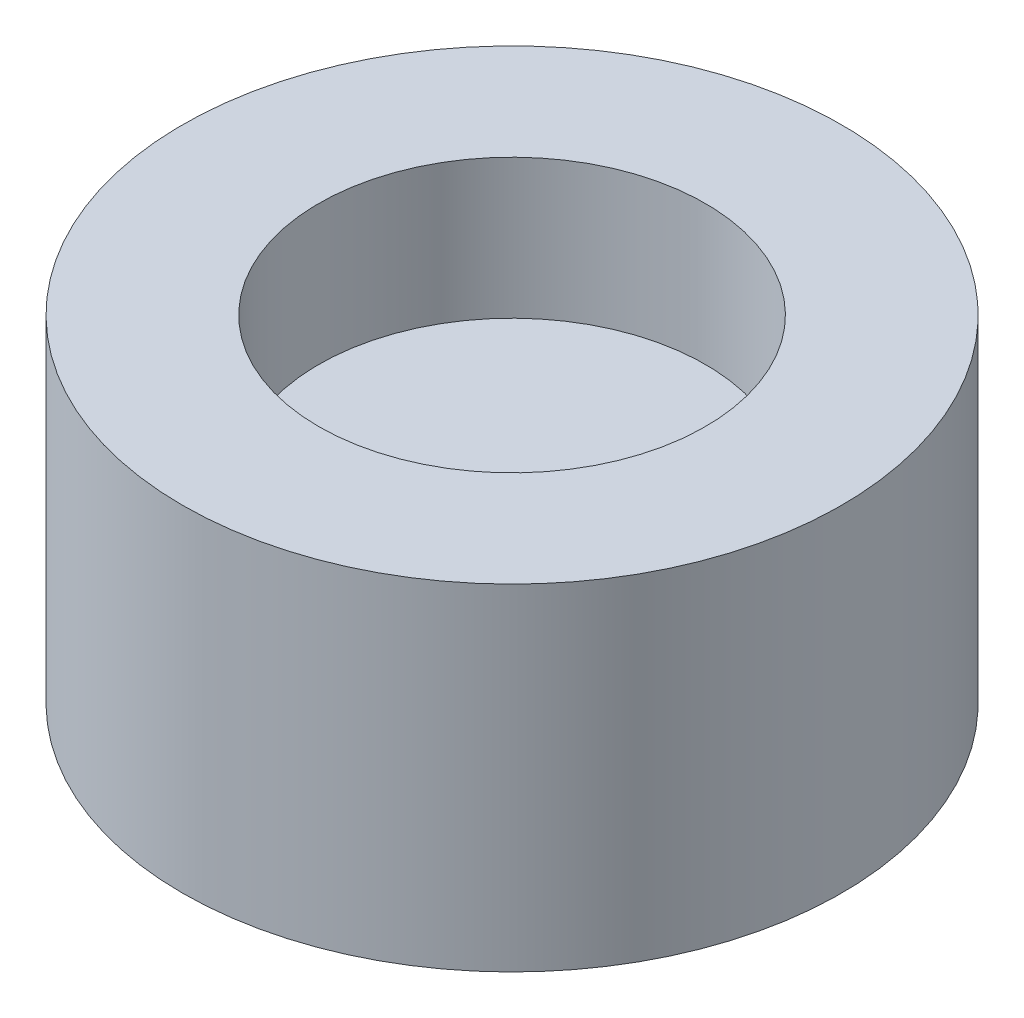
ISO-10303-21;
HEADER;
FILE_DESCRIPTION(('STEP AP214'),'2;1');
FILE_NAME('part.step','',(''),(''),'','','');
FILE_SCHEMA(('AUTOMOTIVE_DESIGN { 1 0 10303 214 1 1 1 1 }'));
ENDSEC;
DATA;
#1=APPLICATION_CONTEXT('core data for automotive mechanical design processes');
#2=APPLICATION_PROTOCOL_DEFINITION('international standard','automotive_design',2000,#1);
#3=PRODUCT_CONTEXT('',#1,'mechanical');
#4=PRODUCT('Part','Part','',(#3));
#5=PRODUCT_RELATED_PRODUCT_CATEGORY('part','',(#4));
#6=PRODUCT_DEFINITION_FORMATION('','',#4);
#7=PRODUCT_DEFINITION_CONTEXT('part definition',#1,'design');
#8=PRODUCT_DEFINITION('design','',#6,#7);
#9=PRODUCT_DEFINITION_SHAPE('','',#8);
#10=(LENGTH_UNIT() NAMED_UNIT(*) SI_UNIT(.MILLI.,.METRE.));
#11=(NAMED_UNIT(*) PLANE_ANGLE_UNIT() SI_UNIT($,.RADIAN.));
#12=(NAMED_UNIT(*) SI_UNIT($,.STERADIAN.) SOLID_ANGLE_UNIT());
#13=UNCERTAINTY_MEASURE_WITH_UNIT(LENGTH_MEASURE(1.E-05),#10,'distance_accuracy_value','');
#14=(GEOMETRIC_REPRESENTATION_CONTEXT(3) GLOBAL_UNCERTAINTY_ASSIGNED_CONTEXT((#13)) GLOBAL_UNIT_ASSIGNED_CONTEXT((#10,
#11,#12)) REPRESENTATION_CONTEXT('',''));
#15=CARTESIAN_POINT('',(0.,0.,0.));
#16=DIRECTION('',(0.,0.,1.));
#17=DIRECTION('',(1.,0.,0.));
#18=AXIS2_PLACEMENT_3D('',#15,#16,#17);
#19=CARTESIAN_POINT('',(0.,0.,0.));
#20=DIRECTION('',(0.,1.,0.));
#21=DIRECTION('',(0.,0.,1.));
#22=AXIS2_PLACEMENT_3D('',#19,#20,#21);
#23=PLANE('',#22);
#24=CARTESIAN_POINT('',(0.,0.,0.));
#25=DIRECTION('',(0.,1.,0.));
#26=DIRECTION('',(0.,0.,1.));
#27=AXIS2_PLACEMENT_3D('',#24,#25,#26);
#28=CIRCLE('',#27,2.95);
#29=CARTESIAN_POINT('',(0.,0.,2.95));
#30=VERTEX_POINT('',#29);
#31=EDGE_CURVE('E43',#30,#30,#28,.T.);
#32=ORIENTED_EDGE('',*,*,#31,.F.);
#33=EDGE_LOOP('',(#32));
#34=FACE_BOUND('',#33,.T.);
#35=CARTESIAN_POINT('',(0.,0.,0.));
#36=DIRECTION('',(0.,1.,0.));
#37=DIRECTION('',(0.,0.,1.));
#38=AXIS2_PLACEMENT_3D('',#35,#36,#37);
#39=CIRCLE('',#38,1.65);
#40=CARTESIAN_POINT('',(0.,0.,1.65));
#41=VERTEX_POINT('',#40);
#42=EDGE_CURVE('E53',#41,#41,#39,.T.);
#43=ORIENTED_EDGE('',*,*,#42,.T.);
#44=EDGE_LOOP('',(#43));
#45=FACE_BOUND('',#44,.T.);
#46=ADVANCED_FACE('F39',(#34,#45),#23,.F.);
#47=CARTESIAN_POINT('',(0.,1.5,0.));
#48=DIRECTION('',(0.,-1.,0.));
#49=DIRECTION('',(0.,0.,-1.));
#50=AXIS2_PLACEMENT_3D('',#47,#48,#49);
#51=CYLINDRICAL_SURFACE('',#50,2.95);
#52=CARTESIAN_POINT('',(0.,1.5,0.));
#53=DIRECTION('',(0.,1.,0.));
#54=DIRECTION('',(0.,0.,1.));
#55=AXIS2_PLACEMENT_3D('',#52,#53,#54);
#56=CIRCLE('',#55,2.95);
#57=CARTESIAN_POINT('',(0.,1.5,2.95));
#58=VERTEX_POINT('',#57);
#59=EDGE_CURVE('E10',#58,#58,#56,.T.);
#60=ORIENTED_EDGE('',*,*,#59,.F.);
#61=EDGE_LOOP('',(#60));
#62=FACE_BOUND('',#61,.T.);
#63=ORIENTED_EDGE('',*,*,#31,.T.);
#64=EDGE_LOOP('',(#63));
#65=FACE_BOUND('',#64,.T.);
#66=ADVANCED_FACE('F41',(#62,#65),#51,.T.);
#67=CARTESIAN_POINT('',(0.,1.5,0.));
#68=DIRECTION('',(0.,-1.,0.));
#69=DIRECTION('',(0.,0.,-1.));
#70=AXIS2_PLACEMENT_3D('',#67,#68,#69);
#71=CYLINDRICAL_SURFACE('',#70,1.65);
#72=ORIENTED_EDGE('',*,*,#42,.F.);
#73=EDGE_LOOP('',(#72));
#74=FACE_BOUND('',#73,.T.);
#75=CARTESIAN_POINT('',(0.,4.5,0.));
#76=DIRECTION('',(0.,1.,0.));
#77=DIRECTION('',(0.,0.,1.));
#78=AXIS2_PLACEMENT_3D('',#75,#76,#77);
#79=CIRCLE('',#78,1.65);
#80=CARTESIAN_POINT('',(0.,4.5,1.65));
#81=VERTEX_POINT('',#80);
#82=EDGE_CURVE('E70',#81,#81,#79,.T.);
#83=ORIENTED_EDGE('',*,*,#82,.T.);
#84=EDGE_LOOP('',(#83));
#85=FACE_BOUND('',#84,.T.);
#86=ADVANCED_FACE('F98',(#74,#85),#71,.F.);
#87=CARTESIAN_POINT('',(0.,6.8,0.));
#88=DIRECTION('',(0.,-1.,0.));
#89=DIRECTION('',(0.,0.,-1.));
#90=AXIS2_PLACEMENT_3D('',#87,#88,#89);
#91=CYLINDRICAL_SURFACE('',#90,5.2);
#92=CARTESIAN_POINT('',(0.,6.8,0.));
#93=DIRECTION('',(0.,1.,0.));
#94=DIRECTION('',(0.,0.,1.));
#95=AXIS2_PLACEMENT_3D('',#92,#93,#94);
#96=CIRCLE('',#95,5.2);
#97=CARTESIAN_POINT('',(0.,6.8,5.2));
#98=VERTEX_POINT('',#97);
#99=EDGE_CURVE('E58',#98,#98,#96,.T.);
#100=ORIENTED_EDGE('',*,*,#99,.F.);
#101=EDGE_LOOP('',(#100));
#102=FACE_BOUND('',#101,.T.);
#103=CARTESIAN_POINT('',(0.,1.5,0.));
#104=DIRECTION('',(0.,1.,0.));
#105=DIRECTION('',(0.,0.,1.));
#106=AXIS2_PLACEMENT_3D('',#103,#104,#105);
#107=CIRCLE('',#106,5.2);
#108=CARTESIAN_POINT('',(0.,1.5,5.2));
#109=VERTEX_POINT('',#108);
#110=EDGE_CURVE('E59',#109,#109,#107,.T.);
#111=ORIENTED_EDGE('',*,*,#110,.T.);
#112=EDGE_LOOP('',(#111));
#113=FACE_BOUND('',#112,.T.);
#114=ADVANCED_FACE('F92',(#102,#113),#91,.T.);
#115=CARTESIAN_POINT('',(0.,6.8,0.));
#116=DIRECTION('',(0.,1.,0.));
#117=DIRECTION('',(0.,0.,1.));
#118=AXIS2_PLACEMENT_3D('',#115,#116,#117);
#119=PLANE('',#118);
#120=CARTESIAN_POINT('',(0.,6.8,0.));
#121=DIRECTION('',(0.,1.,0.));
#122=DIRECTION('',(0.,0.,1.));
#123=AXIS2_PLACEMENT_3D('',#120,#121,#122);
#124=CIRCLE('',#123,3.05);
#125=CARTESIAN_POINT('',(0.,6.8,3.05));
#126=VERTEX_POINT('',#125);
#127=EDGE_CURVE('E63',#126,#126,#124,.T.);
#128=ORIENTED_EDGE('',*,*,#127,.F.);
#129=EDGE_LOOP('',(#128));
#130=FACE_BOUND('',#129,.T.);
#131=ORIENTED_EDGE('',*,*,#99,.T.);
#132=EDGE_LOOP('',(#131));
#133=FACE_BOUND('',#132,.T.);
#134=ADVANCED_FACE('F89',(#130,#133),#119,.T.);
#135=CARTESIAN_POINT('',(0.,1.5,0.));
#136=DIRECTION('',(0.,1.,0.));
#137=DIRECTION('',(0.,0.,1.));
#138=AXIS2_PLACEMENT_3D('',#135,#136,#137);
#139=PLANE('',#138);
#140=ORIENTED_EDGE('',*,*,#59,.T.);
#141=EDGE_LOOP('',(#140));
#142=FACE_BOUND('',#141,.T.);
#143=ORIENTED_EDGE('',*,*,#110,.F.);
#144=EDGE_LOOP('',(#143));
#145=FACE_BOUND('',#144,.T.);
#146=ADVANCED_FACE('F85',(#142,#145),#139,.F.);
#147=CARTESIAN_POINT('',(0.,4.5,0.));
#148=DIRECTION('',(0.,1.,0.));
#149=DIRECTION('',(0.,0.,1.));
#150=AXIS2_PLACEMENT_3D('',#147,#148,#149);
#151=CYLINDRICAL_SURFACE('',#150,3.05);
#152=CARTESIAN_POINT('',(0.,4.6,0.));
#153=DIRECTION('',(0.,1.,0.));
#154=DIRECTION('',(0.,0.,1.));
#155=AXIS2_PLACEMENT_3D('',#152,#153,#154);
#156=CIRCLE('',#155,3.05);
#157=CARTESIAN_POINT('',(0.,4.6,3.05));
#158=VERTEX_POINT('',#157);
#159=EDGE_CURVE('E74',#158,#158,#156,.T.);
#160=ORIENTED_EDGE('',*,*,#159,.F.);
#161=EDGE_LOOP('',(#160));
#162=FACE_BOUND('',#161,.T.);
#163=ORIENTED_EDGE('',*,*,#127,.T.);
#164=EDGE_LOOP('',(#163));
#165=FACE_BOUND('',#164,.T.);
#166=ADVANCED_FACE('F82',(#162,#165),#151,.F.);
#167=CARTESIAN_POINT('',(0.,4.6,0.));
#168=DIRECTION('',(0.,1.,0.));
#169=DIRECTION('',(0.,0.,1.));
#170=AXIS2_PLACEMENT_3D('',#167,#168,#169);
#171=PLANE('',#170);
#172=ORIENTED_EDGE('',*,*,#159,.T.);
#173=EDGE_LOOP('',(#172));
#174=FACE_BOUND('',#173,.T.);
#175=ADVANCED_FACE('F80',(#174),#171,.T.);
#176=CARTESIAN_POINT('',(0.,4.5,0.));
#177=DIRECTION('',(0.,1.,0.));
#178=DIRECTION('',(0.,0.,1.));
#179=AXIS2_PLACEMENT_3D('',#176,#177,#178);
#180=PLANE('',#179);
#181=ORIENTED_EDGE('',*,*,#82,.F.);
#182=EDGE_LOOP('',(#181));
#183=FACE_BOUND('',#182,.T.);
#184=ADVANCED_FACE('F123',(#183),#180,.F.);
#185=CLOSED_SHELL('',(#46,#66,#86,#114,#134,#146,#166,#175,#184));
#186=MANIFOLD_SOLID_BREP('B2',#185);
#187=ADVANCED_BREP_SHAPE_REPRESENTATION('',(#18,#186),#14);
#188=SHAPE_DEFINITION_REPRESENTATION(#9,#187);
ENDSEC;
END-ISO-10303-21;
